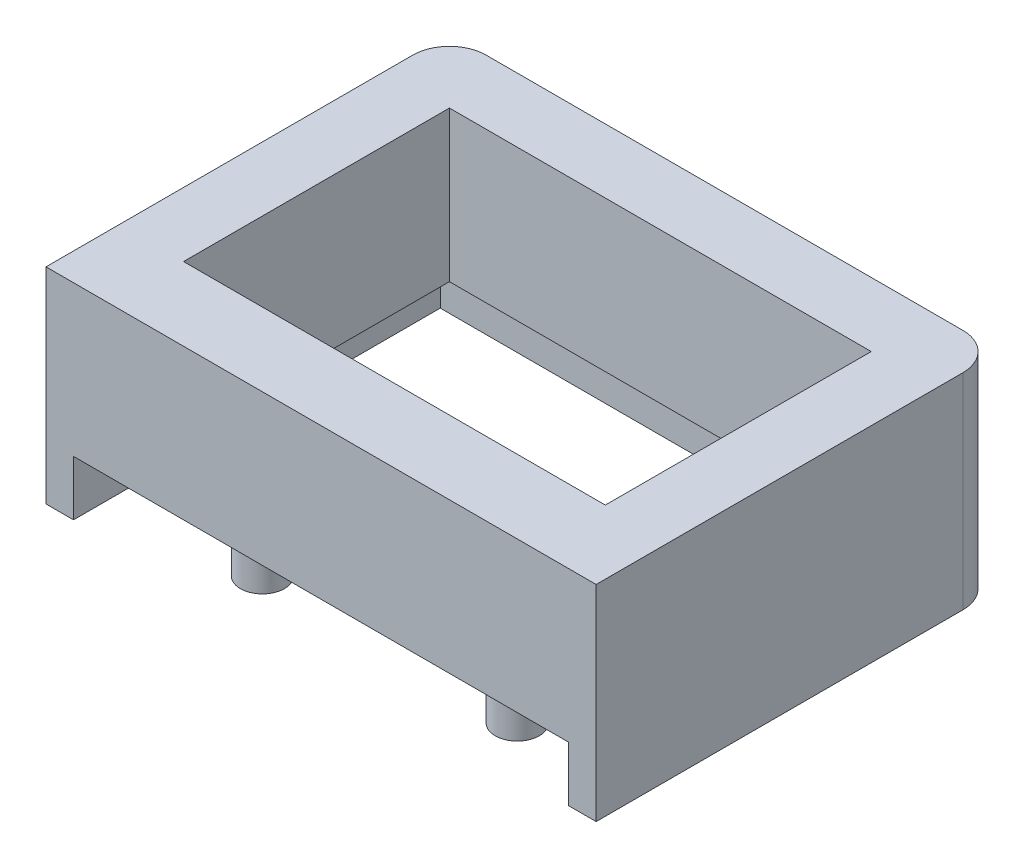
ISO-10303-21;
HEADER;
FILE_DESCRIPTION(('STEP AP214'),'2;1');
FILE_NAME('part.step','',(''),(''),'','','');
FILE_SCHEMA(('AUTOMOTIVE_DESIGN { 1 0 10303 214 1 1 1 1 }'));
ENDSEC;
DATA;
#1=APPLICATION_CONTEXT('core data for automotive mechanical design processes');
#2=APPLICATION_PROTOCOL_DEFINITION('international standard','automotive_design',2000,#1);
#3=PRODUCT_CONTEXT('',#1,'mechanical');
#4=PRODUCT('Part','Part','',(#3));
#5=PRODUCT_RELATED_PRODUCT_CATEGORY('part','',(#4));
#6=PRODUCT_DEFINITION_FORMATION('','',#4);
#7=PRODUCT_DEFINITION_CONTEXT('part definition',#1,'design');
#8=PRODUCT_DEFINITION('design','',#6,#7);
#9=PRODUCT_DEFINITION_SHAPE('','',#8);
#10=(LENGTH_UNIT() NAMED_UNIT(*) SI_UNIT(.MILLI.,.METRE.));
#11=(NAMED_UNIT(*) PLANE_ANGLE_UNIT() SI_UNIT($,.RADIAN.));
#12=(NAMED_UNIT(*) SI_UNIT($,.STERADIAN.) SOLID_ANGLE_UNIT());
#13=UNCERTAINTY_MEASURE_WITH_UNIT(LENGTH_MEASURE(1.E-05),#10,'distance_accuracy_value','');
#14=(GEOMETRIC_REPRESENTATION_CONTEXT(3) GLOBAL_UNCERTAINTY_ASSIGNED_CONTEXT((#13)) GLOBAL_UNIT_ASSIGNED_CONTEXT((#10,
#11,#12)) REPRESENTATION_CONTEXT('',''));
#15=CARTESIAN_POINT('',(0.,0.,0.));
#16=DIRECTION('',(0.,0.,1.));
#17=DIRECTION('',(1.,0.,0.));
#18=AXIS2_PLACEMENT_3D('',#15,#16,#17);
#19=CARTESIAN_POINT('',(0.,4.,0.));
#20=DIRECTION('',(0.,-1.,0.));
#21=DIRECTION('',(0.,0.,-1.));
#22=AXIS2_PLACEMENT_3D('',#19,#20,#21);
#23=PLANE('',#22);
#24=DIRECTION('',(1.,0.,0.));
#25=VECTOR('',#24,1.);
#26=CARTESIAN_POINT('',(-15.,4.,10.));
#27=LINE('',#26,#25);
#28=CARTESIAN_POINT('',(-13.5,4.,10.));
#29=VERTEX_POINT('',#28);
#30=CARTESIAN_POINT('',(13.5,4.,10.));
#31=VERTEX_POINT('',#30);
#32=EDGE_CURVE('E151',#29,#31,#27,.T.);
#33=ORIENTED_EDGE('',*,*,#32,.F.);
#34=DIRECTION('',(0.,0.,1.));
#35=VECTOR('',#34,1.);
#36=CARTESIAN_POINT('',(-13.5,4.,-10.));
#37=LINE('',#36,#35);
#38=CARTESIAN_POINT('',(-13.5,4.,-10.));
#39=VERTEX_POINT('',#38);
#40=EDGE_CURVE('E154',#39,#29,#37,.T.);
#41=ORIENTED_EDGE('',*,*,#40,.F.);
#42=DIRECTION('',(1.,0.,0.));
#43=VECTOR('',#42,1.);
#44=CARTESIAN_POINT('',(0.,4.,-10.));
#45=LINE('',#44,#43);
#46=CARTESIAN_POINT('',(13.5,4.,-10.));
#47=VERTEX_POINT('',#46);
#48=EDGE_CURVE('E163',#39,#47,#45,.T.);
#49=ORIENTED_EDGE('',*,*,#48,.T.);
#50=DIRECTION('',(0.,0.,1.));
#51=VECTOR('',#50,1.);
#52=CARTESIAN_POINT('',(13.5,4.,-10.));
#53=LINE('',#52,#51);
#54=EDGE_CURVE('E157',#47,#31,#53,.T.);
#55=ORIENTED_EDGE('',*,*,#54,.T.);
#56=EDGE_LOOP('',(#33,#41,#49,#55));
#57=FACE_BOUND('',#56,.T.);
#58=DIRECTION('',(-1.,0.,0.));
#59=VECTOR('',#58,1.);
#60=CARTESIAN_POINT('',(-15.,4.,6.));
#61=LINE('',#60,#59);
#62=CARTESIAN_POINT('',(8.2,4.,6.));
#63=VERTEX_POINT('',#62);
#64=CARTESIAN_POINT('',(-5.69999992195549,4.,6.));
#65=VERTEX_POINT('',#64);
#66=EDGE_CURVE('E65',#63,#65,#61,.T.);
#67=ORIENTED_EDGE('',*,*,#66,.F.);
#68=CARTESIAN_POINT('',(8.20000000000001,4.,7.5));
#69=DIRECTION('',(0.,-1.,0.));
#70=DIRECTION('',(0.,0.,-1.));
#71=AXIS2_PLACEMENT_3D('',#68,#69,#70);
#72=CIRCLE('',#71,1.5);
#73=EDGE_CURVE('E58',#63,#63,#72,.T.);
#74=ORIENTED_EDGE('',*,*,#73,.F.);
#75=CARTESIAN_POINT('',(11.5,4.,6.));
#76=VERTEX_POINT('',#75);
#77=EDGE_CURVE('E284',#76,#63,#61,.T.);
#78=ORIENTED_EDGE('',*,*,#77,.F.);
#79=DIRECTION('',(0.,0.,1.));
#80=VECTOR('',#79,1.);
#81=CARTESIAN_POINT('',(11.5,4.,0.));
#82=LINE('',#81,#80);
#83=CARTESIAN_POINT('',(11.5,4.,-8.5));
#84=VERTEX_POINT('',#83);
#85=EDGE_CURVE('E260',#84,#76,#82,.T.);
#86=ORIENTED_EDGE('',*,*,#85,.F.);
#87=DIRECTION('',(1.,0.,0.));
#88=VECTOR('',#87,1.);
#89=CARTESIAN_POINT('',(0.,4.,-8.5));
#90=LINE('',#89,#88);
#91=CARTESIAN_POINT('',(-11.5,4.,-8.5));
#92=VERTEX_POINT('',#91);
#93=EDGE_CURVE('E258',#92,#84,#90,.T.);
#94=ORIENTED_EDGE('',*,*,#93,.F.);
#95=DIRECTION('',(0.,0.,1.));
#96=VECTOR('',#95,1.);
#97=CARTESIAN_POINT('',(-11.5,4.,0.));
#98=LINE('',#97,#96);
#99=CARTESIAN_POINT('',(-11.5,4.,6.));
#100=VERTEX_POINT('',#99);
#101=EDGE_CURVE('E255',#92,#100,#98,.T.);
#102=ORIENTED_EDGE('',*,*,#101,.T.);
#103=EDGE_CURVE('E162',#65,#100,#61,.T.);
#104=ORIENTED_EDGE('',*,*,#103,.F.);
#105=CARTESIAN_POINT('',(-5.69999999999999,4.,7.5));
#106=DIRECTION('',(0.,-1.,0.));
#107=DIRECTION('',(0.,0.,-1.));
#108=AXIS2_PLACEMENT_3D('',#105,#106,#107);
#109=CIRCLE('',#108,1.5);
#110=EDGE_CURVE('E286',#65,#65,#109,.T.);
#111=ORIENTED_EDGE('',*,*,#110,.F.);
#112=EDGE_LOOP('',(#67,#74,#78,#86,#94,#102,#104,#111));
#113=FACE_BOUND('',#112,.T.);
#114=ADVANCED_FACE('F43',(#57,#113),#23,.T.);
#115=CARTESIAN_POINT('',(20.,1.,10.));
#116=DIRECTION('',(0.,1.,0.));
#117=DIRECTION('',(0.,0.,1.));
#118=AXIS2_PLACEMENT_3D('',#115,#116,#117);
#119=PLANE('',#118);
#120=DIRECTION('',(1.,0.,0.));
#121=VECTOR('',#120,1.);
#122=CARTESIAN_POINT('',(0.,0.999999999999998,-10.));
#123=LINE('',#122,#121);
#124=CARTESIAN_POINT('',(-13.5,0.999999999999999,-10.));
#125=VERTEX_POINT('',#124);
#126=CARTESIAN_POINT('',(13.5,0.999999999999999,-10.));
#127=VERTEX_POINT('',#126);
#128=EDGE_CURVE('E242',#125,#127,#123,.T.);
#129=ORIENTED_EDGE('',*,*,#128,.F.);
#130=DIRECTION('',(0.,0.,-1.));
#131=VECTOR('',#130,1.);
#132=CARTESIAN_POINT('',(-13.5,1.,10.));
#133=LINE('',#132,#131);
#134=CARTESIAN_POINT('',(-13.5,0.999999999999999,10.));
#135=VERTEX_POINT('',#134);
#136=EDGE_CURVE('E172',#135,#125,#133,.T.);
#137=ORIENTED_EDGE('',*,*,#136,.F.);
#138=DIRECTION('',(-1.,0.,0.));
#139=VECTOR('',#138,1.);
#140=CARTESIAN_POINT('',(20.,1.,10.));
#141=LINE('',#140,#139);
#142=CARTESIAN_POINT('',(-15.,1.,10.));
#143=VERTEX_POINT('',#142);
#144=EDGE_CURVE('E177',#135,#143,#141,.T.);
#145=ORIENTED_EDGE('',*,*,#144,.T.);
#146=DIRECTION('',(0.,0.,-1.));
#147=VECTOR('',#146,1.);
#148=CARTESIAN_POINT('',(-15.,1.,10.));
#149=LINE('',#148,#147);
#150=CARTESIAN_POINT('',(-15.,0.999999999999998,-9.99999999999999));
#151=VERTEX_POINT('',#150);
#152=EDGE_CURVE('E235',#143,#151,#149,.T.);
#153=ORIENTED_EDGE('',*,*,#152,.T.);
#154=CARTESIAN_POINT('',(-13.,0.999999999999998,-10.));
#155=DIRECTION('',(0.,-1.,0.));
#156=DIRECTION('',(0.,0.,-1.));
#157=AXIS2_PLACEMENT_3D('',#154,#155,#156);
#158=CIRCLE('',#157,2.);
#159=CARTESIAN_POINT('',(-13.,0.999999999999997,-12.));
#160=VERTEX_POINT('',#159);
#161=EDGE_CURVE('E229',#160,#151,#158,.F.);
#162=ORIENTED_EDGE('',*,*,#161,.F.);
#163=DIRECTION('',(-1.,0.,0.));
#164=VECTOR('',#163,1.);
#165=CARTESIAN_POINT('',(20.,0.999999999999997,-12.));
#166=LINE('',#165,#164);
#167=CARTESIAN_POINT('',(13.,0.999999999999997,-12.));
#168=VERTEX_POINT('',#167);
#169=EDGE_CURVE('E240',#168,#160,#166,.T.);
#170=ORIENTED_EDGE('',*,*,#169,.F.);
#171=CARTESIAN_POINT('',(13.,0.999999999999998,-10.));
#172=DIRECTION('',(0.,-1.,0.));
#173=DIRECTION('',(0.,0.,-1.));
#174=AXIS2_PLACEMENT_3D('',#171,#172,#173);
#175=CIRCLE('',#174,2.);
#176=CARTESIAN_POINT('',(15.,0.999999999999998,-9.99999999999999));
#177=VERTEX_POINT('',#176);
#178=EDGE_CURVE('E223',#168,#177,#175,.T.);
#179=ORIENTED_EDGE('',*,*,#178,.T.);
#180=DIRECTION('',(0.,0.,-1.));
#181=VECTOR('',#180,1.);
#182=CARTESIAN_POINT('',(15.,1.,10.));
#183=LINE('',#182,#181);
#184=CARTESIAN_POINT('',(15.,1.,10.));
#185=VERTEX_POINT('',#184);
#186=EDGE_CURVE('E249',#185,#177,#183,.T.);
#187=ORIENTED_EDGE('',*,*,#186,.F.);
#188=CARTESIAN_POINT('',(13.5,0.999999999999999,10.));
#189=VERTEX_POINT('',#188);
#190=EDGE_CURVE('E243',#185,#189,#141,.T.);
#191=ORIENTED_EDGE('',*,*,#190,.T.);
#192=DIRECTION('',(0.,0.,-1.));
#193=VECTOR('',#192,1.);
#194=CARTESIAN_POINT('',(13.5,1.,10.));
#195=LINE('',#194,#193);
#196=EDGE_CURVE('E188',#189,#127,#195,.T.);
#197=ORIENTED_EDGE('',*,*,#196,.T.);
#198=EDGE_LOOP('',(#129,#137,#145,#153,#162,#170,#179,#187,#191,#197));
#199=FACE_BOUND('',#198,.T.);
#200=ADVANCED_FACE('F366',(#199),#119,.F.);
#201=CARTESIAN_POINT('',(-15.,9.,10.));
#202=DIRECTION('',(0.,0.,-1.));
#203=DIRECTION('',(-1.,0.,0.));
#204=AXIS2_PLACEMENT_3D('',#201,#202,#203);
#205=PLANE('',#204);
#206=DIRECTION('',(0.,-1.,0.));
#207=VECTOR('',#206,1.);
#208=CARTESIAN_POINT('',(-13.5,4.,10.));
#209=LINE('',#208,#207);
#210=EDGE_CURVE('E168',#29,#135,#209,.T.);
#211=ORIENTED_EDGE('',*,*,#210,.F.);
#212=ORIENTED_EDGE('',*,*,#32,.T.);
#213=DIRECTION('',(0.,-1.,0.));
#214=VECTOR('',#213,1.);
#215=CARTESIAN_POINT('',(13.5,4.,10.));
#216=LINE('',#215,#214);
#217=EDGE_CURVE('E186',#31,#189,#216,.T.);
#218=ORIENTED_EDGE('',*,*,#217,.T.);
#219=ORIENTED_EDGE('',*,*,#190,.F.);
#220=DIRECTION('',(0.,-1.,0.));
#221=VECTOR('',#220,1.);
#222=CARTESIAN_POINT('',(15.,9.,10.));
#223=LINE('',#222,#221);
#224=CARTESIAN_POINT('',(15.,12.2,10.));
#225=VERTEX_POINT('',#224);
#226=EDGE_CURVE('E276',#225,#185,#223,.T.);
#227=ORIENTED_EDGE('',*,*,#226,.F.);
#228=DIRECTION('',(1.,0.,0.));
#229=VECTOR('',#228,1.);
#230=CARTESIAN_POINT('',(-15.,12.2,10.));
#231=LINE('',#230,#229);
#232=CARTESIAN_POINT('',(-15.,12.2,10.));
#233=VERTEX_POINT('',#232);
#234=EDGE_CURVE('E217',#233,#225,#231,.T.);
#235=ORIENTED_EDGE('',*,*,#234,.F.);
#236=DIRECTION('',(0.,-1.,0.));
#237=VECTOR('',#236,1.);
#238=CARTESIAN_POINT('',(-15.,9.,10.));
#239=LINE('',#238,#237);
#240=EDGE_CURVE('E52',#233,#143,#239,.T.);
#241=ORIENTED_EDGE('',*,*,#240,.T.);
#242=ORIENTED_EDGE('',*,*,#144,.F.);
#243=EDGE_LOOP('',(#211,#212,#218,#219,#227,#235,#241,#242));
#244=FACE_BOUND('',#243,.T.);
#245=ADVANCED_FACE('F175',(#244),#205,.F.);
#246=CARTESIAN_POINT('',(0.,4.,-12.));
#247=DIRECTION('',(0.,0.,-1.));
#248=DIRECTION('',(-1.,0.,0.));
#249=AXIS2_PLACEMENT_3D('',#246,#247,#248);
#250=PLANE('',#249);
#251=DIRECTION('',(0.,-1.,0.));
#252=VECTOR('',#251,1.);
#253=CARTESIAN_POINT('',(-13.,11.,-12.));
#254=LINE('',#253,#252);
#255=CARTESIAN_POINT('',(-13.,12.2,-12.));
#256=VERTEX_POINT('',#255);
#257=EDGE_CURVE('E231',#256,#160,#254,.T.);
#258=ORIENTED_EDGE('',*,*,#257,.F.);
#259=DIRECTION('',(-1.,0.,0.));
#260=VECTOR('',#259,1.);
#261=CARTESIAN_POINT('',(13.,12.2,-12.));
#262=LINE('',#261,#260);
#263=CARTESIAN_POINT('',(13.,12.2,-12.));
#264=VERTEX_POINT('',#263);
#265=EDGE_CURVE('E208',#264,#256,#262,.T.);
#266=ORIENTED_EDGE('',*,*,#265,.F.);
#267=DIRECTION('',(0.,-1.,0.));
#268=VECTOR('',#267,1.);
#269=CARTESIAN_POINT('',(13.,11.,-12.));
#270=LINE('',#269,#268);
#271=EDGE_CURVE('E226',#264,#168,#270,.T.);
#272=ORIENTED_EDGE('',*,*,#271,.T.);
#273=ORIENTED_EDGE('',*,*,#169,.T.);
#274=EDGE_LOOP('',(#258,#266,#272,#273));
#275=FACE_BOUND('',#274,.T.);
#276=ADVANCED_FACE('F377',(#275),#250,.T.);
#277=CARTESIAN_POINT('',(15.,9.,10.));
#278=DIRECTION('',(-1.,0.,0.));
#279=DIRECTION('',(0.,0.,1.));
#280=AXIS2_PLACEMENT_3D('',#277,#278,#279);
#281=PLANE('',#280);
#282=DIRECTION('',(0.,-1.,0.));
#283=VECTOR('',#282,1.);
#284=CARTESIAN_POINT('',(15.,11.,-10.));
#285=LINE('',#284,#283);
#286=CARTESIAN_POINT('',(15.,12.2,-10.));
#287=VERTEX_POINT('',#286);
#288=EDGE_CURVE('E12',#287,#177,#285,.T.);
#289=ORIENTED_EDGE('',*,*,#288,.F.);
#290=DIRECTION('',(0.,0.,-1.));
#291=VECTOR('',#290,1.);
#292=CARTESIAN_POINT('',(15.,12.2,10.));
#293=LINE('',#292,#291);
#294=EDGE_CURVE('E220',#225,#287,#293,.T.);
#295=ORIENTED_EDGE('',*,*,#294,.F.);
#296=ORIENTED_EDGE('',*,*,#226,.T.);
#297=ORIENTED_EDGE('',*,*,#186,.T.);
#298=EDGE_LOOP('',(#289,#295,#296,#297));
#299=FACE_BOUND('',#298,.T.);
#300=ADVANCED_FACE('F352',(#299),#281,.F.);
#301=CARTESIAN_POINT('',(-15.,9.,10.));
#302=DIRECTION('',(1.,0.,0.));
#303=DIRECTION('',(0.,0.,-1.));
#304=AXIS2_PLACEMENT_3D('',#301,#302,#303);
#305=PLANE('',#304);
#306=DIRECTION('',(0.,-1.,0.));
#307=VECTOR('',#306,1.);
#308=CARTESIAN_POINT('',(-15.,11.,-9.99999999999999));
#309=LINE('',#308,#307);
#310=CARTESIAN_POINT('',(-15.,12.2,-9.99999999999999));
#311=VERTEX_POINT('',#310);
#312=EDGE_CURVE('E232',#311,#151,#309,.T.);
#313=ORIENTED_EDGE('',*,*,#312,.T.);
#314=ORIENTED_EDGE('',*,*,#152,.F.);
#315=ORIENTED_EDGE('',*,*,#240,.F.);
#316=DIRECTION('',(0.,0.,1.));
#317=VECTOR('',#316,1.);
#318=CARTESIAN_POINT('',(-15.,12.2,-9.99999999999999));
#319=LINE('',#318,#317);
#320=EDGE_CURVE('E214',#311,#233,#319,.T.);
#321=ORIENTED_EDGE('',*,*,#320,.F.);
#322=EDGE_LOOP('',(#313,#314,#315,#321));
#323=FACE_BOUND('',#322,.T.);
#324=ADVANCED_FACE('F362',(#323),#305,.F.);
#325=CARTESIAN_POINT('',(-15.,9.,6.));
#326=DIRECTION('',(0.,0.,1.));
#327=DIRECTION('',(1.,0.,0.));
#328=AXIS2_PLACEMENT_3D('',#325,#326,#327);
#329=PLANE('',#328);
#330=ORIENTED_EDGE('',*,*,#77,.T.);
#331=ORIENTED_EDGE('',*,*,#66,.T.);
#332=ORIENTED_EDGE('',*,*,#103,.T.);
#333=DIRECTION('',(0.,-1.,0.));
#334=VECTOR('',#333,1.);
#335=CARTESIAN_POINT('',(-11.5,9.,6.));
#336=LINE('',#335,#334);
#337=CARTESIAN_POINT('',(-11.5,12.2,6.));
#338=VERTEX_POINT('',#337);
#339=EDGE_CURVE('E270',#338,#100,#336,.T.);
#340=ORIENTED_EDGE('',*,*,#339,.F.);
#341=DIRECTION('',(1.,0.,0.));
#342=VECTOR('',#341,1.);
#343=CARTESIAN_POINT('',(11.5,12.2,6.));
#344=LINE('',#343,#342);
#345=CARTESIAN_POINT('',(11.5,12.2,6.));
#346=VERTEX_POINT('',#345);
#347=EDGE_CURVE('E199',#338,#346,#344,.T.);
#348=ORIENTED_EDGE('',*,*,#347,.T.);
#349=DIRECTION('',(0.,-1.,0.));
#350=VECTOR('',#349,1.);
#351=CARTESIAN_POINT('',(11.5,9.,6.));
#352=LINE('',#351,#350);
#353=EDGE_CURVE('E262',#346,#76,#352,.T.);
#354=ORIENTED_EDGE('',*,*,#353,.T.);
#355=EDGE_LOOP('',(#330,#331,#332,#340,#348,#354));
#356=FACE_BOUND('',#355,.T.);
#357=ADVANCED_FACE('F402',(#356),#329,.F.);
#358=CARTESIAN_POINT('',(0.,4.,-10.));
#359=DIRECTION('',(0.,0.,-1.));
#360=DIRECTION('',(-1.,0.,0.));
#361=AXIS2_PLACEMENT_3D('',#358,#359,#360);
#362=PLANE('',#361);
#363=ORIENTED_EDGE('',*,*,#48,.F.);
#364=DIRECTION('',(0.,-1.,0.));
#365=VECTOR('',#364,1.);
#366=CARTESIAN_POINT('',(-13.5,4.,-10.));
#367=LINE('',#366,#365);
#368=EDGE_CURVE('E171',#39,#125,#367,.T.);
#369=ORIENTED_EDGE('',*,*,#368,.T.);
#370=ORIENTED_EDGE('',*,*,#128,.T.);
#371=DIRECTION('',(0.,-1.,0.));
#372=VECTOR('',#371,1.);
#373=CARTESIAN_POINT('',(13.5,4.,-10.));
#374=LINE('',#373,#372);
#375=EDGE_CURVE('E185',#47,#127,#374,.T.);
#376=ORIENTED_EDGE('',*,*,#375,.F.);
#377=EDGE_LOOP('',(#363,#369,#370,#376));
#378=FACE_BOUND('',#377,.T.);
#379=ADVANCED_FACE('F369',(#378),#362,.F.);
#380=CARTESIAN_POINT('',(-11.5,9.,0.));
#381=DIRECTION('',(1.,0.,0.));
#382=DIRECTION('',(0.,0.,-1.));
#383=AXIS2_PLACEMENT_3D('',#380,#381,#382);
#384=PLANE('',#383);
#385=ORIENTED_EDGE('',*,*,#101,.F.);
#386=DIRECTION('',(0.,-1.,0.));
#387=VECTOR('',#386,1.);
#388=CARTESIAN_POINT('',(-11.5,9.,-8.5));
#389=LINE('',#388,#387);
#390=CARTESIAN_POINT('',(-11.5,12.2,-8.5));
#391=VERTEX_POINT('',#390);
#392=EDGE_CURVE('E268',#391,#92,#389,.T.);
#393=ORIENTED_EDGE('',*,*,#392,.F.);
#394=DIRECTION('',(0.,0.,1.));
#395=VECTOR('',#394,1.);
#396=CARTESIAN_POINT('',(-11.5,12.2,-8.5));
#397=LINE('',#396,#395);
#398=EDGE_CURVE('E196',#391,#338,#397,.T.);
#399=ORIENTED_EDGE('',*,*,#398,.T.);
#400=ORIENTED_EDGE('',*,*,#339,.T.);
#401=EDGE_LOOP('',(#385,#393,#399,#400));
#402=FACE_BOUND('',#401,.T.);
#403=ADVANCED_FACE('F426',(#402),#384,.T.);
#404=CARTESIAN_POINT('',(0.,9.,-8.5));
#405=DIRECTION('',(0.,0.,-1.));
#406=DIRECTION('',(-1.,0.,0.));
#407=AXIS2_PLACEMENT_3D('',#404,#405,#406);
#408=PLANE('',#407);
#409=ORIENTED_EDGE('',*,*,#93,.T.);
#410=DIRECTION('',(0.,-1.,0.));
#411=VECTOR('',#410,1.);
#412=CARTESIAN_POINT('',(11.5,9.,-8.5));
#413=LINE('',#412,#411);
#414=CARTESIAN_POINT('',(11.5,12.2,-8.5));
#415=VERTEX_POINT('',#414);
#416=EDGE_CURVE('E265',#415,#84,#413,.T.);
#417=ORIENTED_EDGE('',*,*,#416,.F.);
#418=DIRECTION('',(-1.,0.,0.));
#419=VECTOR('',#418,1.);
#420=CARTESIAN_POINT('',(-11.5,12.2,-8.5));
#421=LINE('',#420,#419);
#422=EDGE_CURVE('E193',#415,#391,#421,.T.);
#423=ORIENTED_EDGE('',*,*,#422,.T.);
#424=ORIENTED_EDGE('',*,*,#392,.T.);
#425=EDGE_LOOP('',(#409,#417,#423,#424));
#426=FACE_BOUND('',#425,.T.);
#427=ADVANCED_FACE('F388',(#426),#408,.F.);
#428=CARTESIAN_POINT('',(11.5,9.,0.));
#429=DIRECTION('',(1.,0.,0.));
#430=DIRECTION('',(0.,0.,-1.));
#431=AXIS2_PLACEMENT_3D('',#428,#429,#430);
#432=PLANE('',#431);
#433=ORIENTED_EDGE('',*,*,#85,.T.);
#434=ORIENTED_EDGE('',*,*,#353,.F.);
#435=DIRECTION('',(0.,0.,-1.));
#436=VECTOR('',#435,1.);
#437=CARTESIAN_POINT('',(11.5,12.2,-8.5));
#438=LINE('',#437,#436);
#439=EDGE_CURVE('E202',#346,#415,#438,.T.);
#440=ORIENTED_EDGE('',*,*,#439,.T.);
#441=ORIENTED_EDGE('',*,*,#416,.T.);
#442=EDGE_LOOP('',(#433,#434,#440,#441));
#443=FACE_BOUND('',#442,.T.);
#444=ADVANCED_FACE('F381',(#443),#432,.F.);
#445=CARTESIAN_POINT('',(-13.,11.,-10.));
#446=DIRECTION('',(0.,-1.,0.));
#447=DIRECTION('',(0.,0.,-1.));
#448=AXIS2_PLACEMENT_3D('',#445,#446,#447);
#449=CYLINDRICAL_SURFACE('',#448,2.);
#450=ORIENTED_EDGE('',*,*,#257,.T.);
#451=ORIENTED_EDGE('',*,*,#161,.T.);
#452=ORIENTED_EDGE('',*,*,#312,.F.);
#453=CARTESIAN_POINT('',(-13.,12.2,-10.));
#454=DIRECTION('',(0.,1.,0.));
#455=DIRECTION('',(0.,0.,1.));
#456=AXIS2_PLACEMENT_3D('',#453,#454,#455);
#457=CIRCLE('',#456,2.);
#458=EDGE_CURVE('E211',#256,#311,#457,.T.);
#459=ORIENTED_EDGE('',*,*,#458,.F.);
#460=EDGE_LOOP('',(#450,#451,#452,#459));
#461=FACE_BOUND('',#460,.T.);
#462=ADVANCED_FACE('F379',(#461),#449,.T.);
#463=CARTESIAN_POINT('',(13.,11.,-10.));
#464=DIRECTION('',(0.,-1.,0.));
#465=DIRECTION('',(0.,0.,-1.));
#466=AXIS2_PLACEMENT_3D('',#463,#464,#465);
#467=CYLINDRICAL_SURFACE('',#466,2.);
#468=ORIENTED_EDGE('',*,*,#271,.F.);
#469=CARTESIAN_POINT('',(13.,12.2,-10.));
#470=DIRECTION('',(0.,1.,0.));
#471=DIRECTION('',(0.,0.,1.));
#472=AXIS2_PLACEMENT_3D('',#469,#470,#471);
#473=CIRCLE('',#472,2.);
#474=EDGE_CURVE('E205',#287,#264,#473,.T.);
#475=ORIENTED_EDGE('',*,*,#474,.F.);
#476=ORIENTED_EDGE('',*,*,#288,.T.);
#477=ORIENTED_EDGE('',*,*,#178,.F.);
#478=EDGE_LOOP('',(#468,#475,#476,#477));
#479=FACE_BOUND('',#478,.T.);
#480=ADVANCED_FACE('F374',(#479),#467,.T.);
#481=CARTESIAN_POINT('',(13.,12.2,-10.));
#482=DIRECTION('',(0.,1.,0.));
#483=DIRECTION('',(0.,0.,1.));
#484=AXIS2_PLACEMENT_3D('',#481,#482,#483);
#485=PLANE('',#484);
#486=ORIENTED_EDGE('',*,*,#474,.T.);
#487=ORIENTED_EDGE('',*,*,#265,.T.);
#488=ORIENTED_EDGE('',*,*,#458,.T.);
#489=ORIENTED_EDGE('',*,*,#320,.T.);
#490=ORIENTED_EDGE('',*,*,#234,.T.);
#491=ORIENTED_EDGE('',*,*,#294,.T.);
#492=EDGE_LOOP('',(#486,#487,#488,#489,#490,#491));
#493=FACE_BOUND('',#492,.T.);
#494=ORIENTED_EDGE('',*,*,#398,.F.);
#495=ORIENTED_EDGE('',*,*,#422,.F.);
#496=ORIENTED_EDGE('',*,*,#439,.F.);
#497=ORIENTED_EDGE('',*,*,#347,.F.);
#498=EDGE_LOOP('',(#494,#495,#496,#497));
#499=FACE_BOUND('',#498,.T.);
#500=ADVANCED_FACE('F356',(#493,#499),#485,.T.);
#501=CARTESIAN_POINT('',(13.5,4.,-10.));
#502=DIRECTION('',(1.,0.,0.));
#503=DIRECTION('',(0.,0.,-1.));
#504=AXIS2_PLACEMENT_3D('',#501,#502,#503);
#505=PLANE('',#504);
#506=ORIENTED_EDGE('',*,*,#217,.F.);
#507=ORIENTED_EDGE('',*,*,#54,.F.);
#508=ORIENTED_EDGE('',*,*,#375,.T.);
#509=ORIENTED_EDGE('',*,*,#196,.F.);
#510=EDGE_LOOP('',(#506,#507,#508,#509));
#511=FACE_BOUND('',#510,.T.);
#512=ADVANCED_FACE('F372',(#511),#505,.F.);
#513=CARTESIAN_POINT('',(-13.5,4.,-10.));
#514=DIRECTION('',(1.,0.,0.));
#515=DIRECTION('',(0.,0.,-1.));
#516=AXIS2_PLACEMENT_3D('',#513,#514,#515);
#517=PLANE('',#516);
#518=ORIENTED_EDGE('',*,*,#136,.T.);
#519=ORIENTED_EDGE('',*,*,#368,.F.);
#520=ORIENTED_EDGE('',*,*,#40,.T.);
#521=ORIENTED_EDGE('',*,*,#210,.T.);
#522=EDGE_LOOP('',(#518,#519,#520,#521));
#523=FACE_BOUND('',#522,.T.);
#524=ADVANCED_FACE('F167',(#523),#517,.T.);
#525=CARTESIAN_POINT('',(-5.69999999999999,3.,7.5));
#526=DIRECTION('',(0.,-1.,0.));
#527=DIRECTION('',(0.,0.,-1.));
#528=AXIS2_PLACEMENT_3D('',#525,#526,#527);
#529=PLANE('',#528);
#530=CARTESIAN_POINT('',(-5.69999999999999,3.,7.5));
#531=DIRECTION('',(0.,-1.,0.));
#532=DIRECTION('',(0.,0.,-1.));
#533=AXIS2_PLACEMENT_3D('',#530,#531,#532);
#534=CIRCLE('',#533,1.2);
#535=CARTESIAN_POINT('',(-5.69999999999999,3.,6.3));
#536=VERTEX_POINT('',#535);
#537=EDGE_CURVE('E179',#536,#536,#534,.T.);
#538=ORIENTED_EDGE('',*,*,#537,.F.);
#539=EDGE_LOOP('',(#538));
#540=FACE_BOUND('',#539,.T.);
#541=CARTESIAN_POINT('',(-5.69999999999999,3.,7.5));
#542=DIRECTION('',(0.,-1.,0.));
#543=DIRECTION('',(0.,0.,-1.));
#544=AXIS2_PLACEMENT_3D('',#541,#542,#543);
#545=CIRCLE('',#544,1.3);
#546=CARTESIAN_POINT('',(-5.69999999999999,3.,6.2));
#547=VERTEX_POINT('',#546);
#548=EDGE_CURVE('E288',#547,#547,#545,.T.);
#549=ORIENTED_EDGE('',*,*,#548,.T.);
#550=EDGE_LOOP('',(#549));
#551=FACE_BOUND('',#550,.T.);
#552=ADVANCED_FACE('F325',(#540,#551),#529,.T.);
#553=CARTESIAN_POINT('',(-5.69999999999999,3.,7.5));
#554=DIRECTION('',(0.,1.,0.));
#555=DIRECTION('',(0.,0.,1.));
#556=AXIS2_PLACEMENT_3D('',#553,#554,#555);
#557=CONICAL_SURFACE('',#556,1.3,0.197395559849882);
#558=ORIENTED_EDGE('',*,*,#110,.T.);
#559=EDGE_LOOP('',(#558));
#560=FACE_BOUND('',#559,.T.);
#561=ORIENTED_EDGE('',*,*,#548,.F.);
#562=EDGE_LOOP('',(#561));
#563=FACE_BOUND('',#562,.T.);
#564=ADVANCED_FACE('F315',(#560,#563),#557,.T.);
#565=CARTESIAN_POINT('',(-5.69999999999999,1.,7.5));
#566=DIRECTION('',(0.,1.,0.));
#567=DIRECTION('',(0.,0.,1.));
#568=AXIS2_PLACEMENT_3D('',#565,#566,#567);
#569=CIRCLE('',#568,1.2);
#570=CARTESIAN_POINT('',(-5.69999999999999,1.,8.7));
#571=VERTEX_POINT('',#570);
#572=EDGE_CURVE('E252',#571,#571,#569,.T.);
#573=ORIENTED_EDGE('',*,*,#572,.F.);
#574=EDGE_LOOP('',(#573));
#575=FACE_BOUND('',#574,.T.);
#576=ADVANCED_FACE('F324',(#575),#119,.F.);
#577=CARTESIAN_POINT('',(-5.69999999999999,4.,7.5));
#578=DIRECTION('',(0.,-1.,0.));
#579=DIRECTION('',(0.,0.,-1.));
#580=AXIS2_PLACEMENT_3D('',#577,#578,#579);
#581=CYLINDRICAL_SURFACE('',#580,1.2);
#582=ORIENTED_EDGE('',*,*,#537,.T.);
#583=EDGE_LOOP('',(#582));
#584=FACE_BOUND('',#583,.T.);
#585=ORIENTED_EDGE('',*,*,#572,.T.);
#586=EDGE_LOOP('',(#585));
#587=FACE_BOUND('',#586,.T.);
#588=ADVANCED_FACE('F45',(#584,#587),#581,.T.);
#589=CARTESIAN_POINT('',(8.20000000000001,3.,7.5));
#590=DIRECTION('',(0.,-1.,0.));
#591=DIRECTION('',(0.,0.,-1.));
#592=AXIS2_PLACEMENT_3D('',#589,#590,#591);
#593=PLANE('',#592);
#594=CARTESIAN_POINT('',(8.20000000000001,3.,7.5));
#595=DIRECTION('',(0.,-1.,0.));
#596=DIRECTION('',(0.,0.,-1.));
#597=AXIS2_PLACEMENT_3D('',#594,#595,#596);
#598=CIRCLE('',#597,1.2);
#599=CARTESIAN_POINT('',(8.20000000000001,3.,6.3));
#600=VERTEX_POINT('',#599);
#601=EDGE_CURVE('E289',#600,#600,#598,.T.);
#602=ORIENTED_EDGE('',*,*,#601,.F.);
#603=EDGE_LOOP('',(#602));
#604=FACE_BOUND('',#603,.T.);
#605=CARTESIAN_POINT('',(8.20000000000001,3.,7.5));
#606=DIRECTION('',(0.,-1.,0.));
#607=DIRECTION('',(0.,0.,-1.));
#608=AXIS2_PLACEMENT_3D('',#605,#606,#607);
#609=CIRCLE('',#608,1.3);
#610=CARTESIAN_POINT('',(8.20000000000001,3.,6.2));
#611=VERTEX_POINT('',#610);
#612=EDGE_CURVE('E293',#611,#611,#609,.T.);
#613=ORIENTED_EDGE('',*,*,#612,.T.);
#614=EDGE_LOOP('',(#613));
#615=FACE_BOUND('',#614,.T.);
#616=ADVANCED_FACE('F327',(#604,#615),#593,.T.);
#617=CARTESIAN_POINT('',(8.20000000000001,3.,7.5));
#618=DIRECTION('',(0.,1.,0.));
#619=DIRECTION('',(0.,0.,1.));
#620=AXIS2_PLACEMENT_3D('',#617,#618,#619);
#621=CONICAL_SURFACE('',#620,1.3,0.197395559849882);
#622=ORIENTED_EDGE('',*,*,#73,.T.);
#623=EDGE_LOOP('',(#622));
#624=FACE_BOUND('',#623,.T.);
#625=ORIENTED_EDGE('',*,*,#612,.F.);
#626=EDGE_LOOP('',(#625));
#627=FACE_BOUND('',#626,.T.);
#628=ADVANCED_FACE('F536',(#624,#627),#621,.T.);
#629=CARTESIAN_POINT('',(8.20000000000001,1.,7.5));
#630=DIRECTION('',(0.,1.,0.));
#631=DIRECTION('',(0.,0.,1.));
#632=AXIS2_PLACEMENT_3D('',#629,#630,#631);
#633=CIRCLE('',#632,1.2);
#634=CARTESIAN_POINT('',(8.20000000000001,1.,8.7));
#635=VERTEX_POINT('',#634);
#636=EDGE_CURVE('E246',#635,#635,#633,.T.);
#637=ORIENTED_EDGE('',*,*,#636,.F.);
#638=EDGE_LOOP('',(#637));
#639=FACE_BOUND('',#638,.T.);
#640=ADVANCED_FACE('F397',(#639),#119,.F.);
#641=CARTESIAN_POINT('',(8.20000000000001,4.,7.5));
#642=DIRECTION('',(0.,-1.,0.));
#643=DIRECTION('',(0.,0.,-1.));
#644=AXIS2_PLACEMENT_3D('',#641,#642,#643);
#645=CYLINDRICAL_SURFACE('',#644,1.2);
#646=ORIENTED_EDGE('',*,*,#601,.T.);
#647=EDGE_LOOP('',(#646));
#648=FACE_BOUND('',#647,.T.);
#649=ORIENTED_EDGE('',*,*,#636,.T.);
#650=EDGE_LOOP('',(#649));
#651=FACE_BOUND('',#650,.T.);
#652=ADVANCED_FACE('F400',(#648,#651),#645,.T.);
#653=CLOSED_SHELL('',(#114,#200,#245,#276,#300,#324,#357,#379,#403,#427,#444,#462,#480,#500,
#512,#524,#552,#564,#576,#588,#616,#628,#640,#652));
#654=MANIFOLD_SOLID_BREP('B2',#653);
#655=ADVANCED_BREP_SHAPE_REPRESENTATION('',(#18,#654),#14);
#656=SHAPE_DEFINITION_REPRESENTATION(#9,#655);
ENDSEC;
END-ISO-10303-21;
